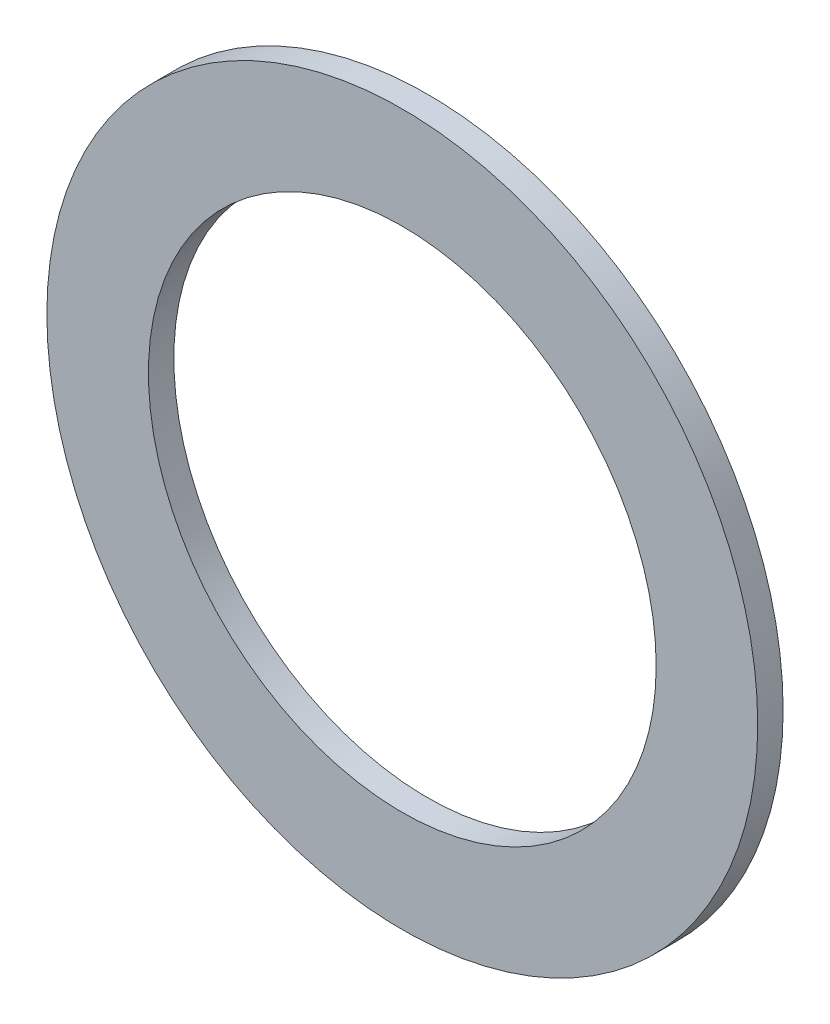
ISO-10303-21;
HEADER;
FILE_DESCRIPTION(('STEP AP214'),'2;1');
FILE_NAME('part.step','',(''),(''),'','','');
FILE_SCHEMA(('AUTOMOTIVE_DESIGN { 1 0 10303 214 1 1 1 1 }'));
ENDSEC;
DATA;
#1=APPLICATION_CONTEXT('core data for automotive mechanical design processes');
#2=APPLICATION_PROTOCOL_DEFINITION('international standard','automotive_design',2000,#1);
#3=PRODUCT_CONTEXT('',#1,'mechanical');
#4=PRODUCT('Part','Part','',(#3));
#5=PRODUCT_RELATED_PRODUCT_CATEGORY('part','',(#4));
#6=PRODUCT_DEFINITION_FORMATION('','',#4);
#7=PRODUCT_DEFINITION_CONTEXT('part definition',#1,'design');
#8=PRODUCT_DEFINITION('design','',#6,#7);
#9=PRODUCT_DEFINITION_SHAPE('','',#8);
#10=(LENGTH_UNIT() NAMED_UNIT(*) SI_UNIT(.MILLI.,.METRE.));
#11=(NAMED_UNIT(*) PLANE_ANGLE_UNIT() SI_UNIT($,.RADIAN.));
#12=(NAMED_UNIT(*) SI_UNIT($,.STERADIAN.) SOLID_ANGLE_UNIT());
#13=UNCERTAINTY_MEASURE_WITH_UNIT(LENGTH_MEASURE(1.E-05),#10,'distance_accuracy_value','');
#14=(GEOMETRIC_REPRESENTATION_CONTEXT(3) GLOBAL_UNCERTAINTY_ASSIGNED_CONTEXT((#13)) GLOBAL_UNIT_ASSIGNED_CONTEXT((#10,
#11,#12)) REPRESENTATION_CONTEXT('',''));
#15=CARTESIAN_POINT('',(0.,0.,0.));
#16=DIRECTION('',(0.,0.,1.));
#17=DIRECTION('',(1.,0.,0.));
#18=AXIS2_PLACEMENT_3D('',#15,#16,#17);
#19=CARTESIAN_POINT('',(0.,0.,0.5));
#20=DIRECTION('',(0.,0.,1.));
#21=DIRECTION('',(1.,0.,0.));
#22=AXIS2_PLACEMENT_3D('',#19,#20,#21);
#23=PLANE('',#22);
#24=CARTESIAN_POINT('',(0.,0.,0.5));
#25=DIRECTION('',(0.,0.,1.));
#26=DIRECTION('',(1.,0.,0.));
#27=AXIS2_PLACEMENT_3D('',#24,#25,#26);
#28=CIRCLE('',#27,7.);
#29=CARTESIAN_POINT('',(7.,0.,0.5));
#30=VERTEX_POINT('',#29);
#31=EDGE_CURVE('E10',#30,#30,#28,.T.);
#32=ORIENTED_EDGE('',*,*,#31,.T.);
#33=EDGE_LOOP('',(#32));
#34=FACE_BOUND('',#33,.T.);
#35=CARTESIAN_POINT('',(0.,0.,0.5));
#36=DIRECTION('',(0.,0.,1.));
#37=DIRECTION('',(1.,0.,0.));
#38=AXIS2_PLACEMENT_3D('',#35,#36,#37);
#39=CIRCLE('',#38,5.);
#40=CARTESIAN_POINT('',(5.,0.,0.5));
#41=VERTEX_POINT('',#40);
#42=EDGE_CURVE('E44',#41,#41,#39,.T.);
#43=ORIENTED_EDGE('',*,*,#42,.F.);
#44=EDGE_LOOP('',(#43));
#45=FACE_BOUND('',#44,.T.);
#46=ADVANCED_FACE('F33',(#34,#45),#23,.T.);
#47=CARTESIAN_POINT('',(0.,0.,0.));
#48=DIRECTION('',(0.,0.,1.));
#49=DIRECTION('',(1.,0.,0.));
#50=AXIS2_PLACEMENT_3D('',#47,#48,#49);
#51=PLANE('',#50);
#52=CARTESIAN_POINT('',(0.,0.,0.));
#53=DIRECTION('',(0.,0.,1.));
#54=DIRECTION('',(1.,0.,0.));
#55=AXIS2_PLACEMENT_3D('',#52,#53,#54);
#56=CIRCLE('',#55,7.);
#57=CARTESIAN_POINT('',(7.,0.,0.));
#58=VERTEX_POINT('',#57);
#59=EDGE_CURVE('E37',#58,#58,#56,.T.);
#60=ORIENTED_EDGE('',*,*,#59,.F.);
#61=EDGE_LOOP('',(#60));
#62=FACE_BOUND('',#61,.T.);
#63=CARTESIAN_POINT('',(0.,0.,0.));
#64=DIRECTION('',(0.,0.,1.));
#65=DIRECTION('',(1.,0.,0.));
#66=AXIS2_PLACEMENT_3D('',#63,#64,#65);
#67=CIRCLE('',#66,5.);
#68=CARTESIAN_POINT('',(5.,0.,0.));
#69=VERTEX_POINT('',#68);
#70=EDGE_CURVE('E46',#69,#69,#67,.T.);
#71=ORIENTED_EDGE('',*,*,#70,.T.);
#72=EDGE_LOOP('',(#71));
#73=FACE_BOUND('',#72,.T.);
#74=ADVANCED_FACE('F56',(#62,#73),#51,.F.);
#75=CARTESIAN_POINT('',(0.,0.,0.5));
#76=DIRECTION('',(0.,0.,-1.));
#77=DIRECTION('',(-1.,0.,0.));
#78=AXIS2_PLACEMENT_3D('',#75,#76,#77);
#79=CYLINDRICAL_SURFACE('',#78,7.);
#80=ORIENTED_EDGE('',*,*,#31,.F.);
#81=EDGE_LOOP('',(#80));
#82=FACE_BOUND('',#81,.T.);
#83=ORIENTED_EDGE('',*,*,#59,.T.);
#84=EDGE_LOOP('',(#83));
#85=FACE_BOUND('',#84,.T.);
#86=ADVANCED_FACE('F35',(#82,#85),#79,.T.);
#87=CARTESIAN_POINT('',(0.,0.,0.5));
#88=DIRECTION('',(0.,0.,-1.));
#89=DIRECTION('',(-1.,0.,0.));
#90=AXIS2_PLACEMENT_3D('',#87,#88,#89);
#91=CYLINDRICAL_SURFACE('',#90,5.);
#92=ORIENTED_EDGE('',*,*,#42,.T.);
#93=EDGE_LOOP('',(#92));
#94=FACE_BOUND('',#93,.T.);
#95=ORIENTED_EDGE('',*,*,#70,.F.);
#96=EDGE_LOOP('',(#95));
#97=FACE_BOUND('',#96,.T.);
#98=ADVANCED_FACE('F52',(#94,#97),#91,.F.);
#99=CLOSED_SHELL('',(#46,#74,#86,#98));
#100=MANIFOLD_SOLID_BREP('B2',#99);
#101=ADVANCED_BREP_SHAPE_REPRESENTATION('',(#18,#100),#14);
#102=SHAPE_DEFINITION_REPRESENTATION(#9,#101);
ENDSEC;
END-ISO-10303-21;
